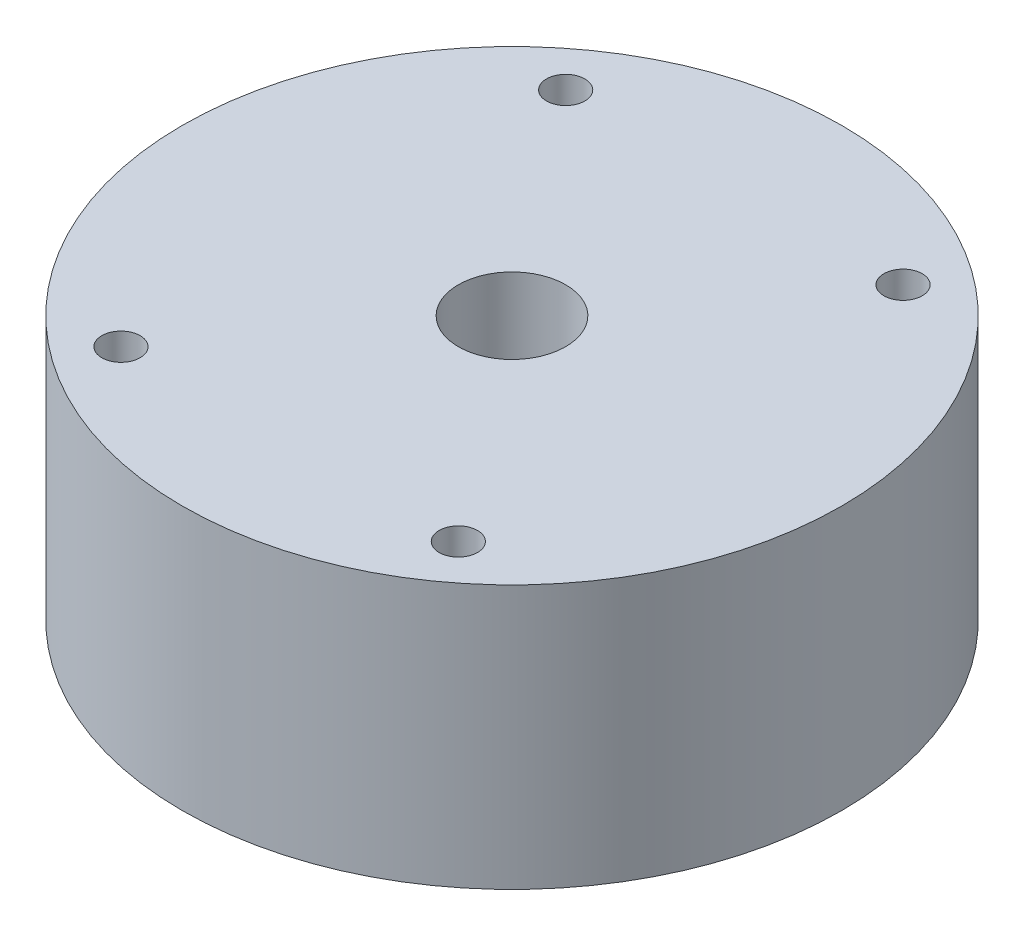
ISO-10303-21;
HEADER;
FILE_DESCRIPTION(('STEP AP214'),'2;1');
FILE_NAME('part.step','',(''),(''),'','','');
FILE_SCHEMA(('AUTOMOTIVE_DESIGN { 1 0 10303 214 1 1 1 1 }'));
ENDSEC;
DATA;
#1=APPLICATION_CONTEXT('core data for automotive mechanical design processes');
#2=APPLICATION_PROTOCOL_DEFINITION('international standard','automotive_design',2000,#1);
#3=PRODUCT_CONTEXT('',#1,'mechanical');
#4=PRODUCT('Part','Part','',(#3));
#5=PRODUCT_RELATED_PRODUCT_CATEGORY('part','',(#4));
#6=PRODUCT_DEFINITION_FORMATION('','',#4);
#7=PRODUCT_DEFINITION_CONTEXT('part definition',#1,'design');
#8=PRODUCT_DEFINITION('design','',#6,#7);
#9=PRODUCT_DEFINITION_SHAPE('','',#8);
#10=(LENGTH_UNIT() NAMED_UNIT(*) SI_UNIT(.MILLI.,.METRE.));
#11=(NAMED_UNIT(*) PLANE_ANGLE_UNIT() SI_UNIT($,.RADIAN.));
#12=(NAMED_UNIT(*) SI_UNIT($,.STERADIAN.) SOLID_ANGLE_UNIT());
#13=UNCERTAINTY_MEASURE_WITH_UNIT(LENGTH_MEASURE(1.E-05),#10,'distance_accuracy_value','');
#14=(GEOMETRIC_REPRESENTATION_CONTEXT(3) GLOBAL_UNCERTAINTY_ASSIGNED_CONTEXT((#13)) GLOBAL_UNIT_ASSIGNED_CONTEXT((#10,
#11,#12)) REPRESENTATION_CONTEXT('',''));
#15=CARTESIAN_POINT('',(0.,0.,0.));
#16=DIRECTION('',(0.,0.,1.));
#17=DIRECTION('',(1.,0.,0.));
#18=AXIS2_PLACEMENT_3D('',#15,#16,#17);
#19=CARTESIAN_POINT('',(0.,26.5,0.));
#20=DIRECTION('',(0.,-1.,0.));
#21=DIRECTION('',(0.,0.,1.));
#22=AXIS2_PLACEMENT_3D('',#19,#20,#21);
#23=CYLINDRICAL_SURFACE('',#22,21.5);
#24=CARTESIAN_POINT('',(0.,0.,0.));
#25=DIRECTION('',(0.,-1.,0.));
#26=DIRECTION('',(0.,0.,-1.));
#27=AXIS2_PLACEMENT_3D('',#24,#25,#26);
#28=CIRCLE('',#27,21.5);
#29=CARTESIAN_POINT('',(0.,0.,-21.5));
#30=VERTEX_POINT('',#29);
#31=EDGE_CURVE('E10',#30,#30,#28,.T.);
#32=ORIENTED_EDGE('',*,*,#31,.F.);
#33=EDGE_LOOP('',(#32));
#34=FACE_BOUND('',#33,.T.);
#35=CARTESIAN_POINT('',(0.,17.2,0.));
#36=DIRECTION('',(0.,-1.,0.));
#37=DIRECTION('',(0.,0.,-1.));
#38=AXIS2_PLACEMENT_3D('',#35,#36,#37);
#39=CIRCLE('',#38,21.5);
#40=CARTESIAN_POINT('',(0.,17.2,-21.5));
#41=VERTEX_POINT('',#40);
#42=EDGE_CURVE('E56',#41,#41,#39,.T.);
#43=ORIENTED_EDGE('',*,*,#42,.T.);
#44=EDGE_LOOP('',(#43));
#45=FACE_BOUND('',#44,.T.);
#46=ADVANCED_FACE('F50',(#34,#45),#23,.T.);
#47=CARTESIAN_POINT('',(11.,26.5,-14.5));
#48=DIRECTION('',(0.,1.,0.));
#49=DIRECTION('',(0.,0.,-1.));
#50=AXIS2_PLACEMENT_3D('',#47,#48,#49);
#51=CYLINDRICAL_SURFACE('',#50,1.25);
#52=CARTESIAN_POINT('',(11.,0.,-14.5));
#53=DIRECTION('',(0.,-1.,0.));
#54=DIRECTION('',(0.,0.,-1.));
#55=AXIS2_PLACEMENT_3D('',#52,#53,#54);
#56=CIRCLE('',#55,1.24999999999999);
#57=CARTESIAN_POINT('',(11.,0.,-15.75));
#58=VERTEX_POINT('',#57);
#59=EDGE_CURVE('E66',#58,#58,#56,.T.);
#60=ORIENTED_EDGE('',*,*,#59,.T.);
#61=EDGE_LOOP('',(#60));
#62=FACE_BOUND('',#61,.T.);
#63=CARTESIAN_POINT('',(11.,17.2,-14.5));
#64=DIRECTION('',(0.,-1.,0.));
#65=DIRECTION('',(0.,0.,-1.));
#66=AXIS2_PLACEMENT_3D('',#63,#64,#65);
#67=CIRCLE('',#66,1.25);
#68=CARTESIAN_POINT('',(11.,17.2,-15.75));
#69=VERTEX_POINT('',#68);
#70=EDGE_CURVE('E111',#69,#69,#67,.F.);
#71=ORIENTED_EDGE('',*,*,#70,.T.);
#72=EDGE_LOOP('',(#71));
#73=FACE_BOUND('',#72,.T.);
#74=ADVANCED_FACE('F88',(#62,#73),#51,.F.);
#75=CARTESIAN_POINT('',(-11.,21.5,-14.5));
#76=DIRECTION('',(0.,1.,0.));
#77=DIRECTION('',(0.,0.,-1.));
#78=AXIS2_PLACEMENT_3D('',#75,#76,#77);
#79=CYLINDRICAL_SURFACE('',#78,1.25);
#80=CARTESIAN_POINT('',(-11.,0.,-14.5));
#81=DIRECTION('',(0.,-1.,0.));
#82=DIRECTION('',(0.,0.,-1.));
#83=AXIS2_PLACEMENT_3D('',#80,#81,#82);
#84=CIRCLE('',#83,1.24999999999999);
#85=CARTESIAN_POINT('',(-11.,0.,-15.75));
#86=VERTEX_POINT('',#85);
#87=EDGE_CURVE('E68',#86,#86,#84,.T.);
#88=ORIENTED_EDGE('',*,*,#87,.T.);
#89=EDGE_LOOP('',(#88));
#90=FACE_BOUND('',#89,.T.);
#91=CARTESIAN_POINT('',(-11.,17.2,-14.5));
#92=DIRECTION('',(0.,-1.,0.));
#93=DIRECTION('',(0.,0.,-1.));
#94=AXIS2_PLACEMENT_3D('',#91,#92,#93);
#95=CIRCLE('',#94,1.25);
#96=CARTESIAN_POINT('',(-11.,17.2,-15.75));
#97=VERTEX_POINT('',#96);
#98=EDGE_CURVE('E119',#97,#97,#95,.F.);
#99=ORIENTED_EDGE('',*,*,#98,.T.);
#100=EDGE_LOOP('',(#99));
#101=FACE_BOUND('',#100,.T.);
#102=ADVANCED_FACE('F97',(#90,#101),#79,.F.);
#103=CARTESIAN_POINT('',(0.,-5.5,0.));
#104=DIRECTION('',(0.,1.,0.));
#105=DIRECTION('',(0.,0.,-1.));
#106=AXIS2_PLACEMENT_3D('',#103,#104,#105);
#107=CYLINDRICAL_SURFACE('',#106,3.5);
#108=CARTESIAN_POINT('',(0.,0.,0.));
#109=DIRECTION('',(0.,-1.,0.));
#110=DIRECTION('',(0.,0.,-1.));
#111=AXIS2_PLACEMENT_3D('',#108,#109,#110);
#112=CIRCLE('',#111,3.5);
#113=CARTESIAN_POINT('',(0.,0.,-3.5));
#114=VERTEX_POINT('',#113);
#115=EDGE_CURVE('E53',#114,#114,#112,.T.);
#116=ORIENTED_EDGE('',*,*,#115,.T.);
#117=EDGE_LOOP('',(#116));
#118=FACE_BOUND('',#117,.T.);
#119=CARTESIAN_POINT('',(0.,17.2,0.));
#120=DIRECTION('',(0.,-1.,0.));
#121=DIRECTION('',(0.,0.,-1.));
#122=AXIS2_PLACEMENT_3D('',#119,#120,#121);
#123=CIRCLE('',#122,3.5);
#124=CARTESIAN_POINT('',(0.,17.2,-3.5));
#125=VERTEX_POINT('',#124);
#126=EDGE_CURVE('E65',#125,#125,#123,.F.);
#127=ORIENTED_EDGE('',*,*,#126,.T.);
#128=EDGE_LOOP('',(#127));
#129=FACE_BOUND('',#128,.T.);
#130=ADVANCED_FACE('F91',(#118,#129),#107,.F.);
#131=CARTESIAN_POINT('',(0.,0.,0.));
#132=DIRECTION('',(0.,1.,0.));
#133=DIRECTION('',(0.,0.,-1.));
#134=AXIS2_PLACEMENT_3D('',#131,#132,#133);
#135=PLANE('',#134);
#136=CARTESIAN_POINT('',(-11.,0.,14.5));
#137=DIRECTION('',(0.,-1.,0.));
#138=DIRECTION('',(0.,0.,-1.));
#139=AXIS2_PLACEMENT_3D('',#136,#137,#138);
#140=CIRCLE('',#139,1.24999999999999);
#141=CARTESIAN_POINT('',(-11.,0.,13.25));
#142=VERTEX_POINT('',#141);
#143=EDGE_CURVE('E76',#142,#142,#140,.T.);
#144=ORIENTED_EDGE('',*,*,#143,.F.);
#145=EDGE_LOOP('',(#144));
#146=FACE_BOUND('',#145,.T.);
#147=CARTESIAN_POINT('',(11.,0.,14.5));
#148=DIRECTION('',(0.,-1.,0.));
#149=DIRECTION('',(0.,0.,-1.));
#150=AXIS2_PLACEMENT_3D('',#147,#148,#149);
#151=CIRCLE('',#150,1.24999999999999);
#152=CARTESIAN_POINT('',(11.,0.,13.25));
#153=VERTEX_POINT('',#152);
#154=EDGE_CURVE('E70',#153,#153,#151,.T.);
#155=ORIENTED_EDGE('',*,*,#154,.F.);
#156=EDGE_LOOP('',(#155));
#157=FACE_BOUND('',#156,.T.);
#158=ORIENTED_EDGE('',*,*,#87,.F.);
#159=EDGE_LOOP('',(#158));
#160=FACE_BOUND('',#159,.T.);
#161=ORIENTED_EDGE('',*,*,#59,.F.);
#162=EDGE_LOOP('',(#161));
#163=FACE_BOUND('',#162,.T.);
#164=ORIENTED_EDGE('',*,*,#115,.F.);
#165=EDGE_LOOP('',(#164));
#166=FACE_BOUND('',#165,.T.);
#167=ORIENTED_EDGE('',*,*,#31,.T.);
#168=EDGE_LOOP('',(#167));
#169=FACE_BOUND('',#168,.T.);
#170=ADVANCED_FACE('F90',(#146,#157,#160,#163,#166,#169),#135,.F.);
#171=CARTESIAN_POINT('',(34.,17.2,21.5));
#172=DIRECTION('',(0.,1.,0.));
#173=DIRECTION('',(0.,0.,-1.));
#174=AXIS2_PLACEMENT_3D('',#171,#172,#173);
#175=PLANE('',#174);
#176=CARTESIAN_POINT('',(-11.,17.2,14.5));
#177=DIRECTION('',(0.,-1.,0.));
#178=DIRECTION('',(0.,0.,-1.));
#179=AXIS2_PLACEMENT_3D('',#176,#177,#178);
#180=CIRCLE('',#179,1.25);
#181=CARTESIAN_POINT('',(-11.,17.2,13.25));
#182=VERTEX_POINT('',#181);
#183=EDGE_CURVE('E49',#182,#182,#180,.T.);
#184=ORIENTED_EDGE('',*,*,#183,.T.);
#185=EDGE_LOOP('',(#184));
#186=FACE_BOUND('',#185,.T.);
#187=CARTESIAN_POINT('',(11.,17.2,14.5));
#188=DIRECTION('',(0.,-1.,0.));
#189=DIRECTION('',(0.,0.,-1.));
#190=AXIS2_PLACEMENT_3D('',#187,#188,#189);
#191=CIRCLE('',#190,1.25);
#192=CARTESIAN_POINT('',(11.,17.2,13.25));
#193=VERTEX_POINT('',#192);
#194=EDGE_CURVE('E67',#193,#193,#191,.T.);
#195=ORIENTED_EDGE('',*,*,#194,.T.);
#196=EDGE_LOOP('',(#195));
#197=FACE_BOUND('',#196,.T.);
#198=ORIENTED_EDGE('',*,*,#126,.F.);
#199=EDGE_LOOP('',(#198));
#200=FACE_BOUND('',#199,.T.);
#201=ORIENTED_EDGE('',*,*,#42,.F.);
#202=EDGE_LOOP('',(#201));
#203=FACE_BOUND('',#202,.T.);
#204=ORIENTED_EDGE('',*,*,#70,.F.);
#205=EDGE_LOOP('',(#204));
#206=FACE_BOUND('',#205,.T.);
#207=ORIENTED_EDGE('',*,*,#98,.F.);
#208=EDGE_LOOP('',(#207));
#209=FACE_BOUND('',#208,.T.);
#210=ADVANCED_FACE('F95',(#186,#197,#200,#203,#206,#209),#175,.T.);
#211=CARTESIAN_POINT('',(11.,26.5,14.5));
#212=DIRECTION('',(0.,1.,0.));
#213=DIRECTION('',(0.,0.,-1.));
#214=AXIS2_PLACEMENT_3D('',#211,#212,#213);
#215=CYLINDRICAL_SURFACE('',#214,1.25);
#216=ORIENTED_EDGE('',*,*,#194,.F.);
#217=EDGE_LOOP('',(#216));
#218=FACE_BOUND('',#217,.T.);
#219=ORIENTED_EDGE('',*,*,#154,.T.);
#220=EDGE_LOOP('',(#219));
#221=FACE_BOUND('',#220,.T.);
#222=ADVANCED_FACE('F104',(#218,#221),#215,.F.);
#223=CARTESIAN_POINT('',(-11.,21.5,14.5));
#224=DIRECTION('',(0.,1.,0.));
#225=DIRECTION('',(0.,0.,-1.));
#226=AXIS2_PLACEMENT_3D('',#223,#224,#225);
#227=CYLINDRICAL_SURFACE('',#226,1.25);
#228=ORIENTED_EDGE('',*,*,#183,.F.);
#229=EDGE_LOOP('',(#228));
#230=FACE_BOUND('',#229,.T.);
#231=ORIENTED_EDGE('',*,*,#143,.T.);
#232=EDGE_LOOP('',(#231));
#233=FACE_BOUND('',#232,.T.);
#234=ADVANCED_FACE('F124',(#230,#233),#227,.F.);
#235=CLOSED_SHELL('',(#46,#74,#102,#130,#170,#210,#222,#234));
#236=MANIFOLD_SOLID_BREP('B2',#235);
#237=ADVANCED_BREP_SHAPE_REPRESENTATION('',(#18,#236),#14);
#238=SHAPE_DEFINITION_REPRESENTATION(#9,#237);
ENDSEC;
END-ISO-10303-21;
